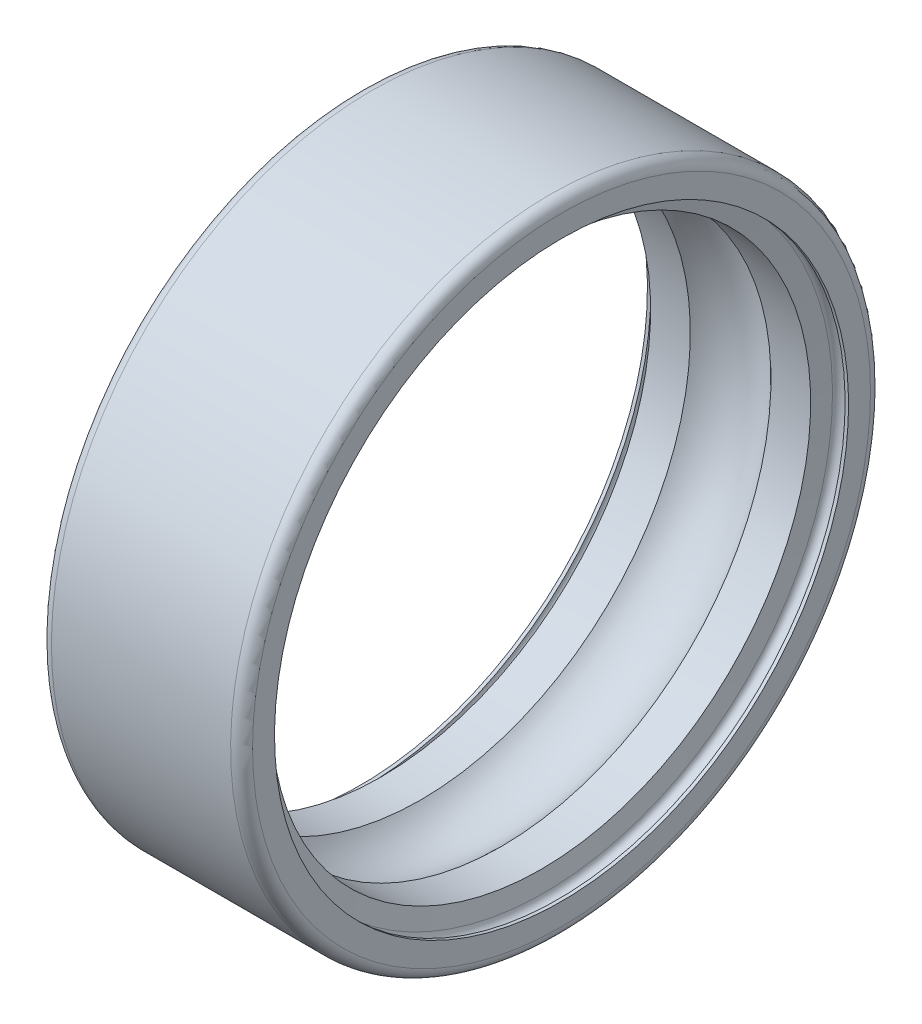
ISO-10303-21;
HEADER;
FILE_DESCRIPTION(('STEP AP214'),'2;1');
FILE_NAME('part.step','',(''),(''),'','','');
FILE_SCHEMA(('AUTOMOTIVE_DESIGN { 1 0 10303 214 1 1 1 1 }'));
ENDSEC;
DATA;
#1=APPLICATION_CONTEXT('core data for automotive mechanical design processes');
#2=APPLICATION_PROTOCOL_DEFINITION('international standard','automotive_design',2000,#1);
#3=PRODUCT_CONTEXT('',#1,'mechanical');
#4=PRODUCT('Part','Part','',(#3));
#5=PRODUCT_RELATED_PRODUCT_CATEGORY('part','',(#4));
#6=PRODUCT_DEFINITION_FORMATION('','',#4);
#7=PRODUCT_DEFINITION_CONTEXT('part definition',#1,'design');
#8=PRODUCT_DEFINITION('design','',#6,#7);
#9=PRODUCT_DEFINITION_SHAPE('','',#8);
#10=(LENGTH_UNIT() NAMED_UNIT(*) SI_UNIT(.MILLI.,.METRE.));
#11=(NAMED_UNIT(*) PLANE_ANGLE_UNIT() SI_UNIT($,.RADIAN.));
#12=(NAMED_UNIT(*) SI_UNIT($,.STERADIAN.) SOLID_ANGLE_UNIT());
#13=UNCERTAINTY_MEASURE_WITH_UNIT(LENGTH_MEASURE(1.E-05),#10,'distance_accuracy_value','');
#14=(GEOMETRIC_REPRESENTATION_CONTEXT(3) GLOBAL_UNCERTAINTY_ASSIGNED_CONTEXT((#13)) GLOBAL_UNIT_ASSIGNED_CONTEXT((#10,
#11,#12)) REPRESENTATION_CONTEXT('',''));
#15=CARTESIAN_POINT('',(0.,0.,0.));
#16=DIRECTION('',(0.,0.,1.));
#17=DIRECTION('',(1.,0.,0.));
#18=AXIS2_PLACEMENT_3D('',#15,#16,#17);
#19=CARTESIAN_POINT('',(10.43,0.,0.));
#20=DIRECTION('',(1.,0.,0.));
#21=DIRECTION('',(0.,0.,-1.));
#22=AXIS2_PLACEMENT_3D('',#19,#20,#21);
#23=TOROIDAL_SURFACE('',#22,15.7,0.38);
#24=CARTESIAN_POINT('',(10.81,0.,0.));
#25=DIRECTION('',(1.,0.,0.));
#26=DIRECTION('',(0.,1.,0.));
#27=AXIS2_PLACEMENT_3D('',#24,#25,#26);
#28=CIRCLE('',#27,15.7);
#29=CARTESIAN_POINT('',(10.81,15.7,0.));
#30=VERTEX_POINT('',#29);
#31=EDGE_CURVE('E11',#30,#30,#28,.T.);
#32=ORIENTED_EDGE('',*,*,#31,.T.);
#33=EDGE_LOOP('',(#32));
#34=FACE_BOUND('',#33,.T.);
#35=CARTESIAN_POINT('',(10.0557730538554,0.,0.));
#36=DIRECTION('',(1.,0.,0.));
#37=DIRECTION('',(0.,1.,0.));
#38=AXIS2_PLACEMENT_3D('',#35,#36,#37);
#39=CIRCLE('',#38,15.7659863075135);
#40=CARTESIAN_POINT('',(10.0557730538554,15.7659863075135,0.));
#41=VERTEX_POINT('',#40);
#42=EDGE_CURVE('E88',#41,#41,#39,.T.);
#43=ORIENTED_EDGE('',*,*,#42,.F.);
#44=EDGE_LOOP('',(#43));
#45=FACE_BOUND('',#44,.T.);
#46=ADVANCED_FACE('F16',(#34,#45),#23,.F.);
#47=CARTESIAN_POINT('',(10.905,0.,0.));
#48=DIRECTION('',(-1.,0.,0.));
#49=DIRECTION('',(0.,1.,0.));
#50=AXIS2_PLACEMENT_3D('',#47,#48,#49);
#51=CYLINDRICAL_SURFACE('',#50,15.7);
#52=CARTESIAN_POINT('',(11.,0.,0.));
#53=DIRECTION('',(1.,0.,0.));
#54=DIRECTION('',(0.,1.,0.));
#55=AXIS2_PLACEMENT_3D('',#52,#53,#54);
#56=CIRCLE('',#55,15.7);
#57=CARTESIAN_POINT('',(11.,15.7,0.));
#58=VERTEX_POINT('',#57);
#59=EDGE_CURVE('E26',#58,#58,#56,.T.);
#60=ORIENTED_EDGE('',*,*,#59,.T.);
#61=EDGE_LOOP('',(#60));
#62=FACE_BOUND('',#61,.T.);
#63=ORIENTED_EDGE('',*,*,#31,.F.);
#64=EDGE_LOOP('',(#63));
#65=FACE_BOUND('',#64,.T.);
#66=ADVANCED_FACE('F113',(#62,#65),#51,.F.);
#67=CARTESIAN_POINT('',(11.,16.3,0.));
#68=DIRECTION('',(1.,0.,0.));
#69=DIRECTION('',(0.,1.,0.));
#70=AXIS2_PLACEMENT_3D('',#67,#68,#69);
#71=PLANE('',#70);
#72=CARTESIAN_POINT('',(11.,0.,0.));
#73=DIRECTION('',(1.,0.,0.));
#74=DIRECTION('',(0.,1.,0.));
#75=AXIS2_PLACEMENT_3D('',#72,#73,#74);
#76=CIRCLE('',#75,16.9);
#77=CARTESIAN_POINT('',(11.,16.9,0.));
#78=VERTEX_POINT('',#77);
#79=EDGE_CURVE('E20',#78,#78,#76,.T.);
#80=ORIENTED_EDGE('',*,*,#79,.T.);
#81=EDGE_LOOP('',(#80));
#82=FACE_BOUND('',#81,.T.);
#83=ORIENTED_EDGE('',*,*,#59,.F.);
#84=EDGE_LOOP('',(#83));
#85=FACE_BOUND('',#84,.T.);
#86=ADVANCED_FACE('F117',(#82,#85),#71,.T.);
#87=CARTESIAN_POINT('',(10.4,0.,0.));
#88=DIRECTION('',(1.,0.,0.));
#89=DIRECTION('',(0.,0.,-1.));
#90=AXIS2_PLACEMENT_3D('',#87,#88,#89);
#91=TOROIDAL_SURFACE('',#90,16.9,0.6);
#92=CARTESIAN_POINT('',(10.4,0.,0.));
#93=DIRECTION('',(1.,0.,0.));
#94=DIRECTION('',(0.,1.,0.));
#95=AXIS2_PLACEMENT_3D('',#92,#93,#94);
#96=CIRCLE('',#95,17.5);
#97=CARTESIAN_POINT('',(10.4,17.5,0.));
#98=VERTEX_POINT('',#97);
#99=EDGE_CURVE('E82',#98,#98,#96,.T.);
#100=ORIENTED_EDGE('',*,*,#99,.T.);
#101=EDGE_LOOP('',(#100));
#102=FACE_BOUND('',#101,.T.);
#103=ORIENTED_EDGE('',*,*,#79,.F.);
#104=EDGE_LOOP('',(#103));
#105=FACE_BOUND('',#104,.T.);
#106=ADVANCED_FACE('F150',(#102,#105),#91,.T.);
#107=CARTESIAN_POINT('',(5.5,0.,0.));
#108=DIRECTION('',(-1.,0.,0.));
#109=DIRECTION('',(0.,1.,0.));
#110=AXIS2_PLACEMENT_3D('',#107,#108,#109);
#111=CYLINDRICAL_SURFACE('',#110,17.5);
#112=CARTESIAN_POINT('',(0.6,0.,0.));
#113=DIRECTION('',(1.,0.,0.));
#114=DIRECTION('',(0.,1.,0.));
#115=AXIS2_PLACEMENT_3D('',#112,#113,#114);
#116=CIRCLE('',#115,17.5);
#117=CARTESIAN_POINT('',(0.6,17.5,0.));
#118=VERTEX_POINT('',#117);
#119=EDGE_CURVE('E80',#118,#118,#116,.T.);
#120=ORIENTED_EDGE('',*,*,#119,.T.);
#121=EDGE_LOOP('',(#120));
#122=FACE_BOUND('',#121,.T.);
#123=ORIENTED_EDGE('',*,*,#99,.F.);
#124=EDGE_LOOP('',(#123));
#125=FACE_BOUND('',#124,.T.);
#126=ADVANCED_FACE('F146',(#122,#125),#111,.T.);
#127=CARTESIAN_POINT('',(0.6,0.,0.));
#128=DIRECTION('',(1.,0.,0.));
#129=DIRECTION('',(0.,0.,-1.));
#130=AXIS2_PLACEMENT_3D('',#127,#128,#129);
#131=TOROIDAL_SURFACE('',#130,16.9,0.6);
#132=CARTESIAN_POINT('',(0.,0.,0.));
#133=DIRECTION('',(1.,0.,0.));
#134=DIRECTION('',(0.,1.,0.));
#135=AXIS2_PLACEMENT_3D('',#132,#133,#134);
#136=CIRCLE('',#135,16.9);
#137=CARTESIAN_POINT('',(0.,16.9,0.));
#138=VERTEX_POINT('',#137);
#139=EDGE_CURVE('E83',#138,#138,#136,.T.);
#140=ORIENTED_EDGE('',*,*,#139,.T.);
#141=EDGE_LOOP('',(#140));
#142=FACE_BOUND('',#141,.T.);
#143=ORIENTED_EDGE('',*,*,#119,.F.);
#144=EDGE_LOOP('',(#143));
#145=FACE_BOUND('',#144,.T.);
#146=ADVANCED_FACE('F138',(#142,#145),#131,.T.);
#147=CARTESIAN_POINT('',(0.,16.3,0.));
#148=DIRECTION('',(-1.,0.,0.));
#149=DIRECTION('',(0.,-1.,0.));
#150=AXIS2_PLACEMENT_3D('',#147,#148,#149);
#151=PLANE('',#150);
#152=CARTESIAN_POINT('',(0.,0.,0.));
#153=DIRECTION('',(1.,0.,0.));
#154=DIRECTION('',(0.,1.,0.));
#155=AXIS2_PLACEMENT_3D('',#152,#153,#154);
#156=CIRCLE('',#155,15.7);
#157=CARTESIAN_POINT('',(0.,15.7,0.));
#158=VERTEX_POINT('',#157);
#159=EDGE_CURVE('E75',#158,#158,#156,.T.);
#160=ORIENTED_EDGE('',*,*,#159,.T.);
#161=EDGE_LOOP('',(#160));
#162=FACE_BOUND('',#161,.T.);
#163=ORIENTED_EDGE('',*,*,#139,.F.);
#164=EDGE_LOOP('',(#163));
#165=FACE_BOUND('',#164,.T.);
#166=ADVANCED_FACE('F126',(#162,#165),#151,.T.);
#167=CARTESIAN_POINT('',(0.0949999999999989,0.,0.));
#168=DIRECTION('',(-1.,0.,0.));
#169=DIRECTION('',(0.,1.,0.));
#170=AXIS2_PLACEMENT_3D('',#167,#168,#169);
#171=CYLINDRICAL_SURFACE('',#170,15.7);
#172=CARTESIAN_POINT('',(0.19,0.,0.));
#173=DIRECTION('',(1.,0.,0.));
#174=DIRECTION('',(0.,1.,0.));
#175=AXIS2_PLACEMENT_3D('',#172,#173,#174);
#176=CIRCLE('',#175,15.7);
#177=CARTESIAN_POINT('',(0.19,15.7,0.));
#178=VERTEX_POINT('',#177);
#179=EDGE_CURVE('E72',#178,#178,#176,.T.);
#180=ORIENTED_EDGE('',*,*,#179,.T.);
#181=EDGE_LOOP('',(#180));
#182=FACE_BOUND('',#181,.T.);
#183=ORIENTED_EDGE('',*,*,#159,.F.);
#184=EDGE_LOOP('',(#183));
#185=FACE_BOUND('',#184,.T.);
#186=ADVANCED_FACE('F129',(#182,#185),#171,.F.);
#187=CARTESIAN_POINT('',(0.57,0.,0.));
#188=DIRECTION('',(1.,0.,0.));
#189=DIRECTION('',(0.,0.,-1.));
#190=AXIS2_PLACEMENT_3D('',#187,#188,#189);
#191=TOROIDAL_SURFACE('',#190,15.7,0.38);
#192=CARTESIAN_POINT('',(0.944226946144637,0.,0.));
#193=DIRECTION('',(1.,0.,0.));
#194=DIRECTION('',(0.,1.,0.));
#195=AXIS2_PLACEMENT_3D('',#192,#193,#194);
#196=CIRCLE('',#195,15.7659863075135);
#197=CARTESIAN_POINT('',(0.944226946144638,15.7659863075135,0.));
#198=VERTEX_POINT('',#197);
#199=EDGE_CURVE('E68',#198,#198,#196,.T.);
#200=ORIENTED_EDGE('',*,*,#199,.T.);
#201=EDGE_LOOP('',(#200));
#202=FACE_BOUND('',#201,.T.);
#203=ORIENTED_EDGE('',*,*,#179,.F.);
#204=EDGE_LOOP('',(#203));
#205=FACE_BOUND('',#204,.T.);
#206=ADVANCED_FACE('F69',(#202,#205),#191,.F.);
#207=CARTESIAN_POINT('',(1.03379984516713,0.,0.));
#208=DIRECTION('',(-1.,0.,0.));
#209=DIRECTION('',(0.,1.,0.));
#210=AXIS2_PLACEMENT_3D('',#207,#208,#209);
#211=CONICAL_SURFACE('',#210,15.2579931537567,1.39626340159546);
#212=CARTESIAN_POINT('',(1.12337274418962,0.,0.));
#213=DIRECTION('',(1.,0.,0.));
#214=DIRECTION('',(0.,1.,0.));
#215=AXIS2_PLACEMENT_3D('',#212,#213,#214);
#216=CIRCLE('',#215,14.75);
#217=CARTESIAN_POINT('',(1.12337274418962,14.75,0.));
#218=VERTEX_POINT('',#217);
#219=EDGE_CURVE('E73',#218,#218,#216,.T.);
#220=ORIENTED_EDGE('',*,*,#219,.T.);
#221=EDGE_LOOP('',(#220));
#222=FACE_BOUND('',#221,.T.);
#223=ORIENTED_EDGE('',*,*,#199,.F.);
#224=EDGE_LOOP('',(#223));
#225=FACE_BOUND('',#224,.T.);
#226=ADVANCED_FACE('F109',(#222,#225),#211,.F.);
#227=CARTESIAN_POINT('',(2.20946676489306,0.,0.));
#228=DIRECTION('',(-1.,0.,0.));
#229=DIRECTION('',(0.,1.,0.));
#230=AXIS2_PLACEMENT_3D('',#227,#228,#229);
#231=CYLINDRICAL_SURFACE('',#230,14.75);
#232=CARTESIAN_POINT('',(3.29556078559648,0.,0.));
#233=DIRECTION('',(1.,0.,0.));
#234=DIRECTION('',(0.,1.,0.));
#235=AXIS2_PLACEMENT_3D('',#232,#233,#234);
#236=CIRCLE('',#235,14.75);
#237=CARTESIAN_POINT('',(3.29556078559648,14.75,0.));
#238=VERTEX_POINT('',#237);
#239=EDGE_CURVE('E77',#238,#238,#236,.T.);
#240=ORIENTED_EDGE('',*,*,#239,.T.);
#241=EDGE_LOOP('',(#240));
#242=FACE_BOUND('',#241,.T.);
#243=ORIENTED_EDGE('',*,*,#219,.F.);
#244=EDGE_LOOP('',(#243));
#245=FACE_BOUND('',#244,.T.);
#246=ADVANCED_FACE('F95',(#242,#245),#231,.F.);
#247=CARTESIAN_POINT('',(5.5,0.,0.));
#248=DIRECTION('',(1.,0.,0.));
#249=DIRECTION('',(0.,0.,-1.));
#250=AXIS2_PLACEMENT_3D('',#247,#248,#249);
#251=TOROIDAL_SURFACE('',#250,12.75,2.9765);
#252=CARTESIAN_POINT('',(7.70443921440352,0.,0.));
#253=DIRECTION('',(1.,0.,0.));
#254=DIRECTION('',(0.,1.,0.));
#255=AXIS2_PLACEMENT_3D('',#252,#253,#254);
#256=CIRCLE('',#255,14.75);
#257=CARTESIAN_POINT('',(7.70443921440352,14.75,0.));
#258=VERTEX_POINT('',#257);
#259=EDGE_CURVE('E86',#258,#258,#256,.T.);
#260=ORIENTED_EDGE('',*,*,#259,.T.);
#261=EDGE_LOOP('',(#260));
#262=FACE_BOUND('',#261,.T.);
#263=ORIENTED_EDGE('',*,*,#239,.F.);
#264=EDGE_LOOP('',(#263));
#265=FACE_BOUND('',#264,.T.);
#266=ADVANCED_FACE('F98',(#262,#265),#251,.F.);
#267=CARTESIAN_POINT('',(8.79053323510695,0.,0.));
#268=DIRECTION('',(-1.,0.,0.));
#269=DIRECTION('',(0.,1.,0.));
#270=AXIS2_PLACEMENT_3D('',#267,#268,#269);
#271=CYLINDRICAL_SURFACE('',#270,14.75);
#272=CARTESIAN_POINT('',(9.87662725581038,0.,0.));
#273=DIRECTION('',(1.,0.,0.));
#274=DIRECTION('',(0.,1.,0.));
#275=AXIS2_PLACEMENT_3D('',#272,#273,#274);
#276=CIRCLE('',#275,14.75);
#277=CARTESIAN_POINT('',(9.87662725581038,14.75,0.));
#278=VERTEX_POINT('',#277);
#279=EDGE_CURVE('E91',#278,#278,#276,.T.);
#280=ORIENTED_EDGE('',*,*,#279,.T.);
#281=EDGE_LOOP('',(#280));
#282=FACE_BOUND('',#281,.T.);
#283=ORIENTED_EDGE('',*,*,#259,.F.);
#284=EDGE_LOOP('',(#283));
#285=FACE_BOUND('',#284,.T.);
#286=ADVANCED_FACE('F18',(#282,#285),#271,.F.);
#287=CARTESIAN_POINT('',(9.96620015483287,0.,0.));
#288=DIRECTION('',(1.,0.,0.));
#289=DIRECTION('',(0.,1.,0.));
#290=AXIS2_PLACEMENT_3D('',#287,#288,#289);
#291=CONICAL_SURFACE('',#290,15.2579931537567,1.39626340159547);
#292=ORIENTED_EDGE('',*,*,#42,.T.);
#293=EDGE_LOOP('',(#292));
#294=FACE_BOUND('',#293,.T.);
#295=ORIENTED_EDGE('',*,*,#279,.F.);
#296=EDGE_LOOP('',(#295));
#297=FACE_BOUND('',#296,.T.);
#298=ADVANCED_FACE('F107',(#294,#297),#291,.F.);
#299=CLOSED_SHELL('',(#46,#66,#86,#106,#126,#146,#166,#186,#206,#226,#246,#266,#286,#298));
#300=MANIFOLD_SOLID_BREP('B1',#299);
#301=ADVANCED_BREP_SHAPE_REPRESENTATION('',(#18,#300),#14);
#302=SHAPE_DEFINITION_REPRESENTATION(#9,#301);
ENDSEC;
END-ISO-10303-21;
